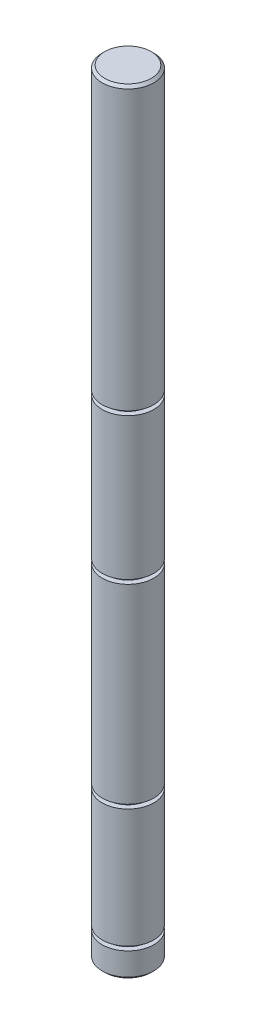
ISO-10303-21;
HEADER;
FILE_DESCRIPTION(('STEP AP214'),'2;1');
FILE_NAME('part.step','',(''),(''),'','','');
FILE_SCHEMA(('AUTOMOTIVE_DESIGN { 1 0 10303 214 1 1 1 1 }'));
ENDSEC;
DATA;
#1=APPLICATION_CONTEXT('core data for automotive mechanical design processes');
#2=APPLICATION_PROTOCOL_DEFINITION('international standard','automotive_design',2000,#1);
#3=PRODUCT_CONTEXT('',#1,'mechanical');
#4=PRODUCT('Part','Part','',(#3));
#5=PRODUCT_RELATED_PRODUCT_CATEGORY('part','',(#4));
#6=PRODUCT_DEFINITION_FORMATION('','',#4);
#7=PRODUCT_DEFINITION_CONTEXT('part definition',#1,'design');
#8=PRODUCT_DEFINITION('design','',#6,#7);
#9=PRODUCT_DEFINITION_SHAPE('','',#8);
#10=(LENGTH_UNIT() NAMED_UNIT(*) SI_UNIT(.MILLI.,.METRE.));
#11=(NAMED_UNIT(*) PLANE_ANGLE_UNIT() SI_UNIT($,.RADIAN.));
#12=(NAMED_UNIT(*) SI_UNIT($,.STERADIAN.) SOLID_ANGLE_UNIT());
#13=UNCERTAINTY_MEASURE_WITH_UNIT(LENGTH_MEASURE(1.E-05),#10,'distance_accuracy_value','');
#14=(GEOMETRIC_REPRESENTATION_CONTEXT(3) GLOBAL_UNCERTAINTY_ASSIGNED_CONTEXT((#13)) GLOBAL_UNIT_ASSIGNED_CONTEXT((#10,
#11,#12)) REPRESENTATION_CONTEXT('',''));
#15=CARTESIAN_POINT('',(0.,0.,0.));
#16=DIRECTION('',(0.,0.,1.));
#17=DIRECTION('',(1.,0.,0.));
#18=AXIS2_PLACEMENT_3D('',#15,#16,#17);
#19=CARTESIAN_POINT('',(0.,150.,0.));
#20=DIRECTION('',(0.,-1.,0.));
#21=DIRECTION('',(0.,0.,-1.));
#22=AXIS2_PLACEMENT_3D('',#19,#20,#21);
#23=CYLINDRICAL_SURFACE('',#22,5.);
#24=CARTESIAN_POINT('',(0.,94.7,0.));
#25=DIRECTION('',(0.,1.,0.));
#26=DIRECTION('',(0.,0.,1.));
#27=AXIS2_PLACEMENT_3D('',#24,#25,#26);
#28=CIRCLE('',#27,5.);
#29=CARTESIAN_POINT('',(0.,94.7,5.));
#30=VERTEX_POINT('',#29);
#31=EDGE_CURVE('E76',#30,#30,#28,.T.);
#32=ORIENTED_EDGE('',*,*,#31,.F.);
#33=EDGE_LOOP('',(#32));
#34=FACE_BOUND('',#33,.T.);
#35=CARTESIAN_POINT('',(0.,67.2,0.));
#36=DIRECTION('',(0.,1.,0.));
#37=DIRECTION('',(0.,0.,1.));
#38=AXIS2_PLACEMENT_3D('',#35,#36,#37);
#39=CIRCLE('',#38,5.);
#40=CARTESIAN_POINT('',(0.,67.2,5.));
#41=VERTEX_POINT('',#40);
#42=EDGE_CURVE('E72',#41,#41,#39,.T.);
#43=ORIENTED_EDGE('',*,*,#42,.T.);
#44=EDGE_LOOP('',(#43));
#45=FACE_BOUND('',#44,.T.);
#46=ADVANCED_FACE('F36',(#34,#45),#23,.T.);
#47=CARTESIAN_POINT('',(0.,29.5,0.));
#48=DIRECTION('',(0.,1.,0.));
#49=DIRECTION('',(0.,0.,1.));
#50=AXIS2_PLACEMENT_3D('',#47,#48,#49);
#51=CIRCLE('',#50,5.00000000000008);
#52=CARTESIAN_POINT('',(0.,29.5,5.00000000000008));
#53=VERTEX_POINT('',#52);
#54=EDGE_CURVE('E106',#53,#53,#51,.T.);
#55=ORIENTED_EDGE('',*,*,#54,.T.);
#56=EDGE_LOOP('',(#55));
#57=FACE_BOUND('',#56,.T.);
#58=CARTESIAN_POINT('',(0.,66.4,0.));
#59=DIRECTION('',(0.,1.,0.));
#60=DIRECTION('',(0.,0.,1.));
#61=AXIS2_PLACEMENT_3D('',#58,#59,#60);
#62=CIRCLE('',#61,5.);
#63=CARTESIAN_POINT('',(0.,66.4,5.));
#64=VERTEX_POINT('',#63);
#65=EDGE_CURVE('E60',#64,#64,#62,.T.);
#66=ORIENTED_EDGE('',*,*,#65,.F.);
#67=EDGE_LOOP('',(#66));
#68=FACE_BOUND('',#67,.T.);
#69=ADVANCED_FACE('F163',(#57,#68),#23,.T.);
#70=CARTESIAN_POINT('',(-5.,66.4,0.));
#71=DIRECTION('',(0.,-1.,0.));
#72=DIRECTION('',(0.,0.,-1.));
#73=AXIS2_PLACEMENT_3D('',#70,#71,#72);
#74=PLANE('',#73);
#75=CARTESIAN_POINT('',(0.,66.4,0.));
#76=DIRECTION('',(0.,1.,0.));
#77=DIRECTION('',(0.,0.,1.));
#78=AXIS2_PLACEMENT_3D('',#75,#76,#77);
#79=CIRCLE('',#78,4.);
#80=CARTESIAN_POINT('',(0.,66.4,4.));
#81=VERTEX_POINT('',#80);
#82=EDGE_CURVE('E64',#81,#81,#79,.T.);
#83=ORIENTED_EDGE('',*,*,#82,.F.);
#84=EDGE_LOOP('',(#83));
#85=FACE_BOUND('',#84,.T.);
#86=ORIENTED_EDGE('',*,*,#65,.T.);
#87=EDGE_LOOP('',(#86));
#88=FACE_BOUND('',#87,.T.);
#89=ADVANCED_FACE('F170',(#85,#88),#74,.F.);
#90=CARTESIAN_POINT('',(0.,141.907824911905,0.));
#91=DIRECTION('',(0.,1.,0.));
#92=DIRECTION('',(0.,0.,1.));
#93=AXIS2_PLACEMENT_3D('',#90,#91,#92);
#94=CYLINDRICAL_SURFACE('',#93,4.);
#95=CARTESIAN_POINT('',(0.,67.2,0.));
#96=DIRECTION('',(0.,1.,0.));
#97=DIRECTION('',(0.,0.,1.));
#98=AXIS2_PLACEMENT_3D('',#95,#96,#97);
#99=CIRCLE('',#98,4.);
#100=CARTESIAN_POINT('',(0.,67.2,4.));
#101=VERTEX_POINT('',#100);
#102=EDGE_CURVE('E68',#101,#101,#99,.T.);
#103=ORIENTED_EDGE('',*,*,#102,.F.);
#104=EDGE_LOOP('',(#103));
#105=FACE_BOUND('',#104,.T.);
#106=ORIENTED_EDGE('',*,*,#82,.T.);
#107=EDGE_LOOP('',(#106));
#108=FACE_BOUND('',#107,.T.);
#109=ADVANCED_FACE('F211',(#105,#108),#94,.T.);
#110=CARTESIAN_POINT('',(-5.,67.2,0.));
#111=DIRECTION('',(0.,1.,0.));
#112=DIRECTION('',(0.,0.,1.));
#113=AXIS2_PLACEMENT_3D('',#110,#111,#112);
#114=PLANE('',#113);
#115=ORIENTED_EDGE('',*,*,#42,.F.);
#116=EDGE_LOOP('',(#115));
#117=FACE_BOUND('',#116,.T.);
#118=ORIENTED_EDGE('',*,*,#102,.T.);
#119=EDGE_LOOP('',(#118));
#120=FACE_BOUND('',#119,.T.);
#121=ADVANCED_FACE('F207',(#117,#120),#114,.F.);
#122=CARTESIAN_POINT('',(-5.,94.7,0.));
#123=DIRECTION('',(0.,-1.,0.));
#124=DIRECTION('',(0.,0.,-1.));
#125=AXIS2_PLACEMENT_3D('',#122,#123,#124);
#126=PLANE('',#125);
#127=CARTESIAN_POINT('',(0.,94.7,0.));
#128=DIRECTION('',(0.,1.,0.));
#129=DIRECTION('',(0.,0.,1.));
#130=AXIS2_PLACEMENT_3D('',#127,#128,#129);
#131=CIRCLE('',#130,4.);
#132=CARTESIAN_POINT('',(0.,94.7,4.));
#133=VERTEX_POINT('',#132);
#134=EDGE_CURVE('E80',#133,#133,#131,.T.);
#135=ORIENTED_EDGE('',*,*,#134,.F.);
#136=EDGE_LOOP('',(#135));
#137=FACE_BOUND('',#136,.T.);
#138=ORIENTED_EDGE('',*,*,#31,.T.);
#139=EDGE_LOOP('',(#138));
#140=FACE_BOUND('',#139,.T.);
#141=ADVANCED_FACE('F203',(#137,#140),#126,.F.);
#142=CARTESIAN_POINT('',(0.,170.207824911905,0.));
#143=DIRECTION('',(0.,1.,0.));
#144=DIRECTION('',(0.,0.,1.));
#145=AXIS2_PLACEMENT_3D('',#142,#143,#144);
#146=CYLINDRICAL_SURFACE('',#145,4.);
#147=CARTESIAN_POINT('',(0.,95.5,0.));
#148=DIRECTION('',(0.,1.,0.));
#149=DIRECTION('',(0.,0.,1.));
#150=AXIS2_PLACEMENT_3D('',#147,#148,#149);
#151=CIRCLE('',#150,4.);
#152=CARTESIAN_POINT('',(0.,95.5,4.));
#153=VERTEX_POINT('',#152);
#154=EDGE_CURVE('E84',#153,#153,#151,.T.);
#155=ORIENTED_EDGE('',*,*,#154,.F.);
#156=EDGE_LOOP('',(#155));
#157=FACE_BOUND('',#156,.T.);
#158=ORIENTED_EDGE('',*,*,#134,.T.);
#159=EDGE_LOOP('',(#158));
#160=FACE_BOUND('',#159,.T.);
#161=ADVANCED_FACE('F199',(#157,#160),#146,.T.);
#162=CARTESIAN_POINT('',(-5.,95.5,0.));
#163=DIRECTION('',(0.,1.,0.));
#164=DIRECTION('',(0.,0.,1.));
#165=AXIS2_PLACEMENT_3D('',#162,#163,#164);
#166=PLANE('',#165);
#167=CARTESIAN_POINT('',(0.,95.5,0.));
#168=DIRECTION('',(0.,1.,0.));
#169=DIRECTION('',(0.,0.,1.));
#170=AXIS2_PLACEMENT_3D('',#167,#168,#169);
#171=CIRCLE('',#170,5.);
#172=CARTESIAN_POINT('',(0.,95.5,5.));
#173=VERTEX_POINT('',#172);
#174=EDGE_CURVE('E88',#173,#173,#171,.T.);
#175=ORIENTED_EDGE('',*,*,#174,.F.);
#176=EDGE_LOOP('',(#175));
#177=FACE_BOUND('',#176,.T.);
#178=ORIENTED_EDGE('',*,*,#154,.T.);
#179=EDGE_LOOP('',(#178));
#180=FACE_BOUND('',#179,.T.);
#181=ADVANCED_FACE('F195',(#177,#180),#166,.F.);
#182=CARTESIAN_POINT('',(0.,150.,0.));
#183=DIRECTION('',(0.,1.,0.));
#184=DIRECTION('',(0.,0.,1.));
#185=AXIS2_PLACEMENT_3D('',#182,#183,#184);
#186=PLANE('',#185);
#187=CARTESIAN_POINT('',(0.,150.,0.));
#188=DIRECTION('',(0.,1.,0.));
#189=DIRECTION('',(0.,0.,1.));
#190=AXIS2_PLACEMENT_3D('',#187,#188,#189);
#191=CIRCLE('',#190,4.50000000000002);
#192=CARTESIAN_POINT('',(0.,150.,4.50000000000002));
#193=VERTEX_POINT('',#192);
#194=EDGE_CURVE('E54',#193,#193,#191,.T.);
#195=ORIENTED_EDGE('',*,*,#194,.T.);
#196=EDGE_LOOP('',(#195));
#197=FACE_BOUND('',#196,.T.);
#198=ADVANCED_FACE('F198',(#197),#186,.T.);
#199=CARTESIAN_POINT('',(0.,150.,0.));
#200=DIRECTION('',(0.,-1.,0.));
#201=DIRECTION('',(0.,0.,-1.));
#202=AXIS2_PLACEMENT_3D('',#199,#200,#201);
#203=CONICAL_SURFACE('',#202,4.50000000000002,0.785398163397458);
#204=CARTESIAN_POINT('',(0.,149.5,0.));
#205=DIRECTION('',(0.,1.,0.));
#206=DIRECTION('',(0.,0.,1.));
#207=AXIS2_PLACEMENT_3D('',#204,#205,#206);
#208=CIRCLE('',#207,5.);
#209=CARTESIAN_POINT('',(0.,149.5,5.));
#210=VERTEX_POINT('',#209);
#211=EDGE_CURVE('E44',#210,#210,#208,.F.);
#212=ORIENTED_EDGE('',*,*,#211,.F.);
#213=EDGE_LOOP('',(#212));
#214=FACE_BOUND('',#213,.T.);
#215=ORIENTED_EDGE('',*,*,#194,.F.);
#216=EDGE_LOOP('',(#215));
#217=FACE_BOUND('',#216,.T.);
#218=ADVANCED_FACE('F220',(#214,#217),#203,.T.);
#219=ORIENTED_EDGE('',*,*,#174,.T.);
#220=EDGE_LOOP('',(#219));
#221=FACE_BOUND('',#220,.T.);
#222=ORIENTED_EDGE('',*,*,#211,.T.);
#223=EDGE_LOOP('',(#222));
#224=FACE_BOUND('',#223,.T.);
#225=ADVANCED_FACE('F151',(#221,#224),#23,.T.);
#226=CARTESIAN_POINT('',(-5.00000000000008,28.7,0.));
#227=DIRECTION('',(0.,-1.,0.));
#228=DIRECTION('',(0.,0.,-1.));
#229=AXIS2_PLACEMENT_3D('',#226,#227,#228);
#230=PLANE('',#229);
#231=CARTESIAN_POINT('',(0.,28.7,0.));
#232=DIRECTION('',(0.,1.,0.));
#233=DIRECTION('',(0.,0.,1.));
#234=AXIS2_PLACEMENT_3D('',#231,#232,#233);
#235=CIRCLE('',#234,4.00000000000008);
#236=CARTESIAN_POINT('',(0.,28.7,4.00000000000008));
#237=VERTEX_POINT('',#236);
#238=EDGE_CURVE('E98',#237,#237,#235,.T.);
#239=ORIENTED_EDGE('',*,*,#238,.F.);
#240=EDGE_LOOP('',(#239));
#241=FACE_BOUND('',#240,.T.);
#242=CARTESIAN_POINT('',(0.,28.7,0.));
#243=DIRECTION('',(0.,1.,0.));
#244=DIRECTION('',(0.,0.,1.));
#245=AXIS2_PLACEMENT_3D('',#242,#243,#244);
#246=CIRCLE('',#245,5.00000000000008);
#247=CARTESIAN_POINT('',(0.,28.7,5.00000000000008));
#248=VERTEX_POINT('',#247);
#249=EDGE_CURVE('E93',#248,#248,#246,.T.);
#250=ORIENTED_EDGE('',*,*,#249,.T.);
#251=EDGE_LOOP('',(#250));
#252=FACE_BOUND('',#251,.T.);
#253=ADVANCED_FACE('F186',(#241,#252),#230,.F.);
#254=CARTESIAN_POINT('',(0.,152.904561977524,0.));
#255=DIRECTION('',(0.,1.,0.));
#256=DIRECTION('',(0.,0.,1.));
#257=AXIS2_PLACEMENT_3D('',#254,#255,#256);
#258=CYLINDRICAL_SURFACE('',#257,4.00000000000008);
#259=CARTESIAN_POINT('',(0.,29.5,0.));
#260=DIRECTION('',(0.,1.,0.));
#261=DIRECTION('',(0.,0.,1.));
#262=AXIS2_PLACEMENT_3D('',#259,#260,#261);
#263=CIRCLE('',#262,4.00000000000008);
#264=CARTESIAN_POINT('',(0.,29.5,4.00000000000008));
#265=VERTEX_POINT('',#264);
#266=EDGE_CURVE('E102',#265,#265,#263,.T.);
#267=ORIENTED_EDGE('',*,*,#266,.F.);
#268=EDGE_LOOP('',(#267));
#269=FACE_BOUND('',#268,.T.);
#270=ORIENTED_EDGE('',*,*,#238,.T.);
#271=EDGE_LOOP('',(#270));
#272=FACE_BOUND('',#271,.T.);
#273=ADVANCED_FACE('F181',(#269,#272),#258,.T.);
#274=CARTESIAN_POINT('',(-5.00000000000008,29.5,0.));
#275=DIRECTION('',(0.,1.,0.));
#276=DIRECTION('',(0.,0.,1.));
#277=AXIS2_PLACEMENT_3D('',#274,#275,#276);
#278=PLANE('',#277);
#279=ORIENTED_EDGE('',*,*,#54,.F.);
#280=EDGE_LOOP('',(#279));
#281=FACE_BOUND('',#280,.T.);
#282=ORIENTED_EDGE('',*,*,#266,.T.);
#283=EDGE_LOOP('',(#282));
#284=FACE_BOUND('',#283,.T.);
#285=ADVANCED_FACE('F175',(#281,#284),#278,.F.);
#286=CARTESIAN_POINT('',(0.,5.69999999999995,0.));
#287=DIRECTION('',(0.,1.,0.));
#288=DIRECTION('',(0.,0.,1.));
#289=AXIS2_PLACEMENT_3D('',#286,#287,#288);
#290=CIRCLE('',#289,5.);
#291=CARTESIAN_POINT('',(0.,5.69999999999995,5.));
#292=VERTEX_POINT('',#291);
#293=EDGE_CURVE('E97',#292,#292,#290,.T.);
#294=ORIENTED_EDGE('',*,*,#293,.T.);
#295=EDGE_LOOP('',(#294));
#296=FACE_BOUND('',#295,.T.);
#297=ORIENTED_EDGE('',*,*,#249,.F.);
#298=EDGE_LOOP('',(#297));
#299=FACE_BOUND('',#298,.T.);
#300=ADVANCED_FACE('F125',(#296,#299),#23,.T.);
#301=CARTESIAN_POINT('',(-4.99999999999999,4.9,0.));
#302=DIRECTION('',(0.,-1.,0.));
#303=DIRECTION('',(0.,0.,-1.));
#304=AXIS2_PLACEMENT_3D('',#301,#302,#303);
#305=PLANE('',#304);
#306=CARTESIAN_POINT('',(0.,4.90000000000002,0.));
#307=DIRECTION('',(0.,1.,0.));
#308=DIRECTION('',(0.,0.,1.));
#309=AXIS2_PLACEMENT_3D('',#306,#307,#308);
#310=CIRCLE('',#309,4.);
#311=CARTESIAN_POINT('',(0.,4.90000000000002,4.));
#312=VERTEX_POINT('',#311);
#313=EDGE_CURVE('E113',#312,#312,#310,.T.);
#314=ORIENTED_EDGE('',*,*,#313,.F.);
#315=EDGE_LOOP('',(#314));
#316=FACE_BOUND('',#315,.T.);
#317=CARTESIAN_POINT('',(0.,4.89999999999999,0.));
#318=DIRECTION('',(0.,1.,0.));
#319=DIRECTION('',(0.,0.,1.));
#320=AXIS2_PLACEMENT_3D('',#317,#318,#319);
#321=CIRCLE('',#320,4.99999999999999);
#322=CARTESIAN_POINT('',(0.,4.89999999999999,4.99999999999999));
#323=VERTEX_POINT('',#322);
#324=EDGE_CURVE('E92',#323,#323,#321,.T.);
#325=ORIENTED_EDGE('',*,*,#324,.T.);
#326=EDGE_LOOP('',(#325));
#327=FACE_BOUND('',#326,.T.);
#328=ADVANCED_FACE('F138',(#316,#327),#305,.F.);
#329=CARTESIAN_POINT('',(0.,152.904561977524,0.));
#330=DIRECTION('',(0.,1.,0.));
#331=DIRECTION('',(0.,0.,1.));
#332=AXIS2_PLACEMENT_3D('',#329,#330,#331);
#333=CYLINDRICAL_SURFACE('',#332,4.);
#334=CARTESIAN_POINT('',(0.,5.69999999999995,0.));
#335=DIRECTION('',(0.,1.,0.));
#336=DIRECTION('',(0.,0.,1.));
#337=AXIS2_PLACEMENT_3D('',#334,#335,#336);
#338=CIRCLE('',#337,4.);
#339=CARTESIAN_POINT('',(0.,5.69999999999995,4.));
#340=VERTEX_POINT('',#339);
#341=EDGE_CURVE('E117',#340,#340,#338,.T.);
#342=ORIENTED_EDGE('',*,*,#341,.F.);
#343=EDGE_LOOP('',(#342));
#344=FACE_BOUND('',#343,.T.);
#345=ORIENTED_EDGE('',*,*,#313,.T.);
#346=EDGE_LOOP('',(#345));
#347=FACE_BOUND('',#346,.T.);
#348=ADVANCED_FACE('F132',(#344,#347),#333,.T.);
#349=CARTESIAN_POINT('',(-5.,5.69999999999995,0.));
#350=DIRECTION('',(0.,1.,0.));
#351=DIRECTION('',(0.,0.,1.));
#352=AXIS2_PLACEMENT_3D('',#349,#350,#351);
#353=PLANE('',#352);
#354=ORIENTED_EDGE('',*,*,#293,.F.);
#355=EDGE_LOOP('',(#354));
#356=FACE_BOUND('',#355,.T.);
#357=ORIENTED_EDGE('',*,*,#341,.T.);
#358=EDGE_LOOP('',(#357));
#359=FACE_BOUND('',#358,.T.);
#360=ADVANCED_FACE('F128',(#356,#359),#353,.F.);
#361=CARTESIAN_POINT('',(0.,0.,0.));
#362=DIRECTION('',(0.,1.,0.));
#363=DIRECTION('',(0.,0.,1.));
#364=AXIS2_PLACEMENT_3D('',#361,#362,#363);
#365=PLANE('',#364);
#366=CARTESIAN_POINT('',(0.,0.,0.));
#367=DIRECTION('',(0.,1.,0.));
#368=DIRECTION('',(0.,0.,1.));
#369=AXIS2_PLACEMENT_3D('',#366,#367,#368);
#370=CIRCLE('',#369,4.49999999999999);
#371=CARTESIAN_POINT('',(0.,0.,4.49999999999999));
#372=VERTEX_POINT('',#371);
#373=EDGE_CURVE('E10',#372,#372,#370,.F.);
#374=ORIENTED_EDGE('',*,*,#373,.T.);
#375=EDGE_LOOP('',(#374));
#376=FACE_BOUND('',#375,.T.);
#377=ADVANCED_FACE('F131',(#376),#365,.F.);
#378=CARTESIAN_POINT('',(0.,0.5,0.));
#379=DIRECTION('',(0.,1.,0.));
#380=DIRECTION('',(0.,0.,1.));
#381=AXIS2_PLACEMENT_3D('',#378,#379,#380);
#382=CONICAL_SURFACE('',#381,5.,0.785398163397458);
#383=ORIENTED_EDGE('',*,*,#373,.F.);
#384=EDGE_LOOP('',(#383));
#385=FACE_BOUND('',#384,.T.);
#386=CARTESIAN_POINT('',(0.,0.5,0.));
#387=DIRECTION('',(0.,1.,0.));
#388=DIRECTION('',(0.,0.,1.));
#389=AXIS2_PLACEMENT_3D('',#386,#387,#388);
#390=CIRCLE('',#389,5.);
#391=CARTESIAN_POINT('',(0.,0.5,5.));
#392=VERTEX_POINT('',#391);
#393=EDGE_CURVE('E49',#392,#392,#390,.T.);
#394=ORIENTED_EDGE('',*,*,#393,.F.);
#395=EDGE_LOOP('',(#394));
#396=FACE_BOUND('',#395,.T.);
#397=ADVANCED_FACE('F38',(#385,#396),#382,.T.);
#398=ORIENTED_EDGE('',*,*,#324,.F.);
#399=EDGE_LOOP('',(#398));
#400=FACE_BOUND('',#399,.T.);
#401=ORIENTED_EDGE('',*,*,#393,.T.);
#402=EDGE_LOOP('',(#401));
#403=FACE_BOUND('',#402,.T.);
#404=ADVANCED_FACE('F147',(#400,#403),#23,.T.);
#405=CLOSED_SHELL('',(#46,#69,#89,#109,#121,#141,#161,#181,#198,#218,#225,#253,#273,#285,#300,
#328,#348,#360,#377,#397,#404));
#406=MANIFOLD_SOLID_BREP('B2',#405);
#407=ADVANCED_BREP_SHAPE_REPRESENTATION('',(#18,#406),#14);
#408=SHAPE_DEFINITION_REPRESENTATION(#9,#407);
ENDSEC;
END-ISO-10303-21;
